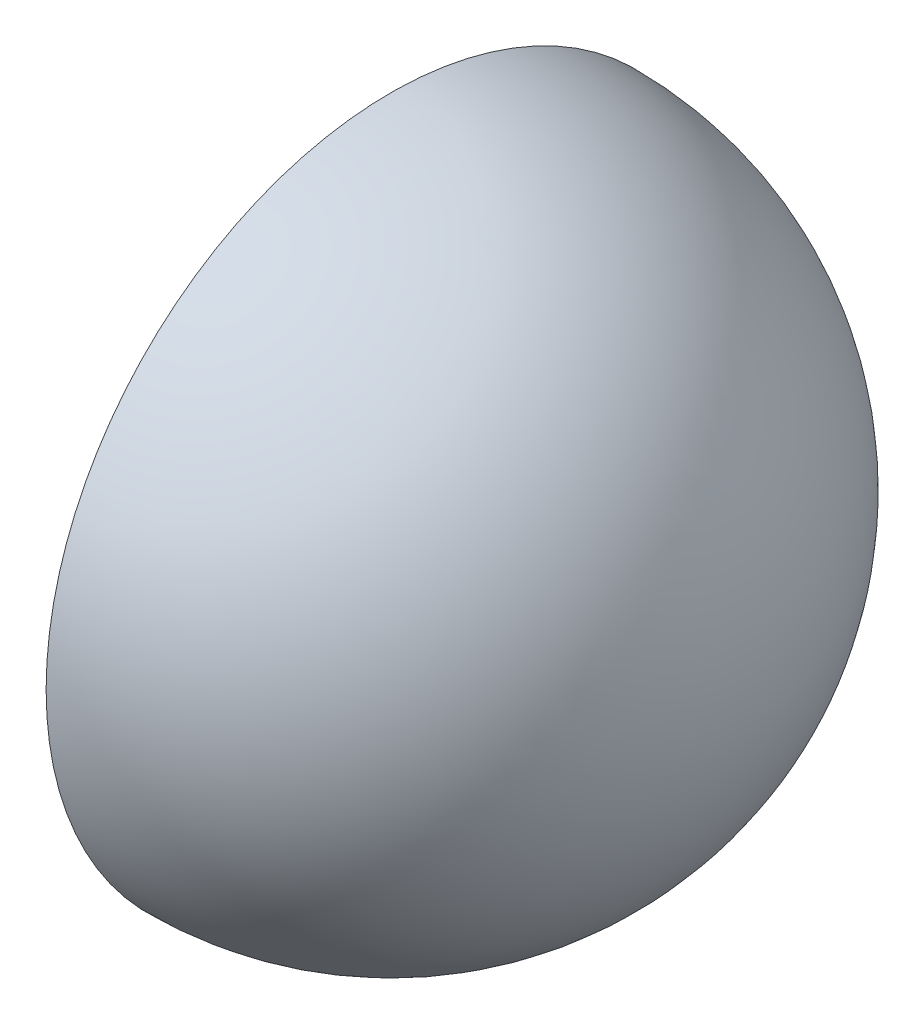
ISO-10303-21;
HEADER;
FILE_DESCRIPTION(('STEP AP214'),'2;1');
FILE_NAME('part.step','',(''),(''),'','','');
FILE_SCHEMA(('AUTOMOTIVE_DESIGN { 1 0 10303 214 1 1 1 1 }'));
ENDSEC;
DATA;
#1=APPLICATION_CONTEXT('core data for automotive mechanical design processes');
#2=APPLICATION_PROTOCOL_DEFINITION('international standard','automotive_design',2000,#1);
#3=PRODUCT_CONTEXT('',#1,'mechanical');
#4=PRODUCT('Part','Part','',(#3));
#5=PRODUCT_RELATED_PRODUCT_CATEGORY('part','',(#4));
#6=PRODUCT_DEFINITION_FORMATION('','',#4);
#7=PRODUCT_DEFINITION_CONTEXT('part definition',#1,'design');
#8=PRODUCT_DEFINITION('design','',#6,#7);
#9=PRODUCT_DEFINITION_SHAPE('','',#8);
#10=(LENGTH_UNIT() NAMED_UNIT(*) SI_UNIT(.MILLI.,.METRE.));
#11=(NAMED_UNIT(*) PLANE_ANGLE_UNIT() SI_UNIT($,.RADIAN.));
#12=(NAMED_UNIT(*) SI_UNIT($,.STERADIAN.) SOLID_ANGLE_UNIT());
#13=UNCERTAINTY_MEASURE_WITH_UNIT(LENGTH_MEASURE(1.E-05),#10,'distance_accuracy_value','');
#14=(GEOMETRIC_REPRESENTATION_CONTEXT(3) GLOBAL_UNCERTAINTY_ASSIGNED_CONTEXT((#13)) GLOBAL_UNIT_ASSIGNED_CONTEXT((#10,
#11,#12)) REPRESENTATION_CONTEXT('',''));
#15=CARTESIAN_POINT('',(0.,0.,0.));
#16=DIRECTION('',(0.,0.,1.));
#17=DIRECTION('',(1.,0.,0.));
#18=AXIS2_PLACEMENT_3D('',#15,#16,#17);
#19=CARTESIAN_POINT('',(0.,0.,0.));
#20=DIRECTION('',(0.,-1.,0.));
#21=DIRECTION('',(0.,0.,-1.));
#22=AXIS2_PLACEMENT_3D('',#19,#20,#21);
#23=SPHERICAL_SURFACE('',#22,250.);
#24=CARTESIAN_POINT('',(0.,0.,0.));
#25=DIRECTION('',(-1.,0.,0.));
#26=DIRECTION('',(0.,0.,1.));
#27=AXIS2_PLACEMENT_3D('',#24,#25,#26);
#28=SPHERICAL_SURFACE('',#27,250.);
#29=CARTESIAN_POINT('',(0.,0.,0.));
#30=DIRECTION('',(-1.,0.,0.));
#31=DIRECTION('',(0.,0.,1.));
#32=AXIS2_PLACEMENT_3D('',#29,#30,#31);
#33=CIRCLE('',#32,250.);
#34=CARTESIAN_POINT('',(1.74574066942157E-12,0.,250.));
#35=VERTEX_POINT('',#34);
#36=EDGE_CURVE('E45',#35,#35,#33,.T.);
#37=ORIENTED_EDGE('',*,*,#36,.F.);
#38=EDGE_LOOP('',(#37));
#39=FACE_BOUND('',#38,.T.);
#40=ADVANCED_FACE('F37',(#39),#28,.T.);
#41=CARTESIAN_POINT('',(0.,0.,0.));
#42=DIRECTION('',(0.,-1.,0.));
#43=DIRECTION('',(0.,0.,1.));
#44=AXIS2_PLACEMENT_3D('',#41,#42,#43);
#45=SPHERICAL_SURFACE('',#44,240.);
#46=CARTESIAN_POINT('',(0.,0.,0.));
#47=DIRECTION('',(1.,0.,0.));
#48=DIRECTION('',(0.,0.,1.));
#49=AXIS2_PLACEMENT_3D('',#46,#47,#48);
#50=SPHERICAL_SURFACE('',#49,240.);
#51=CARTESIAN_POINT('',(0.,0.,0.));
#52=DIRECTION('',(1.,0.,0.));
#53=DIRECTION('',(0.,0.,1.));
#54=AXIS2_PLACEMENT_3D('',#51,#52,#53);
#55=CIRCLE('',#54,240.);
#56=CARTESIAN_POINT('',(1.6759110426447E-12,0.,240.));
#57=VERTEX_POINT('',#56);
#58=EDGE_CURVE('E10',#57,#57,#55,.T.);
#59=ORIENTED_EDGE('',*,*,#58,.F.);
#60=EDGE_LOOP('',(#59));
#61=FACE_BOUND('',#60,.T.);
#62=ADVANCED_FACE('F39',(#61),#50,.F.);
#63=CARTESIAN_POINT('',(0.,0.,0.));
#64=DIRECTION('',(-1.,0.,0.));
#65=DIRECTION('',(0.,0.,1.));
#66=AXIS2_PLACEMENT_3D('',#63,#64,#65);
#67=PLANE('',#66);
#68=ORIENTED_EDGE('',*,*,#58,.T.);
#69=EDGE_LOOP('',(#68));
#70=FACE_BOUND('',#69,.T.);
#71=ORIENTED_EDGE('',*,*,#36,.T.);
#72=EDGE_LOOP('',(#71));
#73=FACE_BOUND('',#72,.T.);
#74=ADVANCED_FACE('F52',(#70,#73),#67,.T.);
#75=CLOSED_SHELL('',(#40,#62,#74));
#76=MANIFOLD_SOLID_BREP('B2',#75);
#77=ADVANCED_BREP_SHAPE_REPRESENTATION('',(#18,#76),#14);
#78=SHAPE_DEFINITION_REPRESENTATION(#9,#77);
ENDSEC;
END-ISO-10303-21;
